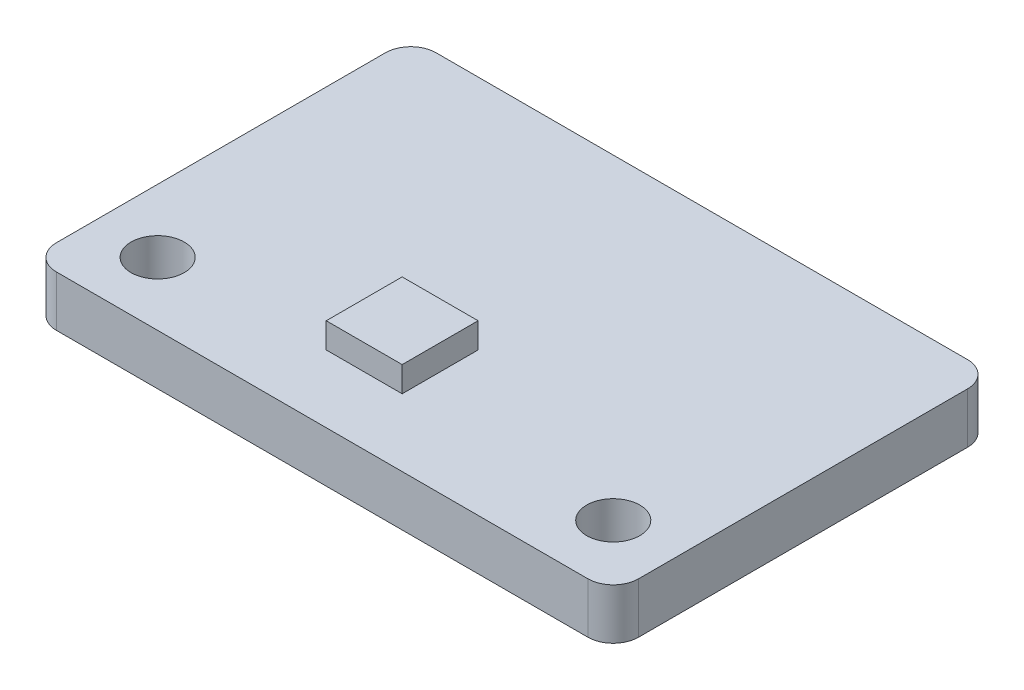
ISO-10303-21;
HEADER;
FILE_DESCRIPTION(('STEP AP214'),'2;1');
FILE_NAME('part.step','',(''),(''),'','','');
FILE_SCHEMA(('AUTOMOTIVE_DESIGN { 1 0 10303 214 1 1 1 1 }'));
ENDSEC;
DATA;
#1=APPLICATION_CONTEXT('core data for automotive mechanical design processes');
#2=APPLICATION_PROTOCOL_DEFINITION('international standard','automotive_design',2000,#1);
#3=PRODUCT_CONTEXT('',#1,'mechanical');
#4=PRODUCT('Part','Part','',(#3));
#5=PRODUCT_RELATED_PRODUCT_CATEGORY('part','',(#4));
#6=PRODUCT_DEFINITION_FORMATION('','',#4);
#7=PRODUCT_DEFINITION_CONTEXT('part definition',#1,'design');
#8=PRODUCT_DEFINITION('design','',#6,#7);
#9=PRODUCT_DEFINITION_SHAPE('','',#8);
#10=(LENGTH_UNIT() NAMED_UNIT(*) SI_UNIT(.MILLI.,.METRE.));
#11=(NAMED_UNIT(*) PLANE_ANGLE_UNIT() SI_UNIT($,.RADIAN.));
#12=(NAMED_UNIT(*) SI_UNIT($,.STERADIAN.) SOLID_ANGLE_UNIT());
#13=UNCERTAINTY_MEASURE_WITH_UNIT(LENGTH_MEASURE(1.E-05),#10,'distance_accuracy_value','');
#14=(GEOMETRIC_REPRESENTATION_CONTEXT(3) GLOBAL_UNCERTAINTY_ASSIGNED_CONTEXT((#13)) GLOBAL_UNIT_ASSIGNED_CONTEXT((#10,
#11,#12)) REPRESENTATION_CONTEXT('',''));
#15=CARTESIAN_POINT('',(0.,0.,0.));
#16=DIRECTION('',(0.,0.,1.));
#17=DIRECTION('',(1.,0.,0.));
#18=AXIS2_PLACEMENT_3D('',#15,#16,#17);
#19=CARTESIAN_POINT('',(1.,2.,-14.));
#20=DIRECTION('',(0.,-1.,0.));
#21=DIRECTION('',(0.,0.,-1.));
#22=AXIS2_PLACEMENT_3D('',#19,#20,#21);
#23=PLANE('',#22);
#24=CARTESIAN_POINT('',(20.5,2.,-2.5));
#25=DIRECTION('',(0.,1.,0.));
#26=DIRECTION('',(0.,0.,-1.));
#27=AXIS2_PLACEMENT_3D('',#24,#25,#26);
#28=CIRCLE('',#27,1.05);
#29=CARTESIAN_POINT('',(20.5,2.,-3.55));
#30=VERTEX_POINT('',#29);
#31=EDGE_CURVE('E149',#30,#30,#28,.T.);
#32=ORIENTED_EDGE('',*,*,#31,.F.);
#33=EDGE_LOOP('',(#32));
#34=FACE_BOUND('',#33,.T.);
#35=CARTESIAN_POINT('',(2.5,2.,-2.5));
#36=DIRECTION('',(0.,1.,0.));
#37=DIRECTION('',(0.,0.,1.));
#38=AXIS2_PLACEMENT_3D('',#35,#36,#37);
#39=CIRCLE('',#38,1.05);
#40=CARTESIAN_POINT('',(2.5,2.,-1.45));
#41=VERTEX_POINT('',#40);
#42=EDGE_CURVE('E158',#41,#41,#39,.T.);
#43=ORIENTED_EDGE('',*,*,#42,.F.);
#44=EDGE_LOOP('',(#43));
#45=FACE_BOUND('',#44,.T.);
#46=CARTESIAN_POINT('',(1.,2.,-14.));
#47=DIRECTION('',(0.,1.,0.));
#48=DIRECTION('',(0.,0.,-1.));
#49=AXIS2_PLACEMENT_3D('',#46,#47,#48);
#50=CIRCLE('',#49,1.);
#51=CARTESIAN_POINT('',(1.00000000000001,2.,-15.));
#52=VERTEX_POINT('',#51);
#53=CARTESIAN_POINT('',(0.,2.,-14.));
#54=VERTEX_POINT('',#53);
#55=EDGE_CURVE('E164',#52,#54,#50,.T.);
#56=ORIENTED_EDGE('',*,*,#55,.T.);
#57=DIRECTION('',(0.,0.,1.));
#58=VECTOR('',#57,1.);
#59=CARTESIAN_POINT('',(0.,2.,-1.00000000000001));
#60=LINE('',#59,#58);
#61=CARTESIAN_POINT('',(0.,2.,-1.00000000000001));
#62=VERTEX_POINT('',#61);
#63=EDGE_CURVE('E167',#54,#62,#60,.T.);
#64=ORIENTED_EDGE('',*,*,#63,.T.);
#65=CARTESIAN_POINT('',(1.,2.,-1.));
#66=DIRECTION('',(0.,1.,0.));
#67=DIRECTION('',(0.,0.,-1.));
#68=AXIS2_PLACEMENT_3D('',#65,#66,#67);
#69=CIRCLE('',#68,1.);
#70=CARTESIAN_POINT('',(1.00000000000001,2.,0.));
#71=VERTEX_POINT('',#70);
#72=EDGE_CURVE('E170',#62,#71,#69,.T.);
#73=ORIENTED_EDGE('',*,*,#72,.T.);
#74=DIRECTION('',(1.,0.,0.));
#75=VECTOR('',#74,1.);
#76=CARTESIAN_POINT('',(1.00000000000001,2.,0.));
#77=LINE('',#76,#75);
#78=CARTESIAN_POINT('',(22.,2.,0.));
#79=VERTEX_POINT('',#78);
#80=EDGE_CURVE('E172',#71,#79,#77,.T.);
#81=ORIENTED_EDGE('',*,*,#80,.T.);
#82=CARTESIAN_POINT('',(22.,2.,-1.));
#83=DIRECTION('',(0.,1.,0.));
#84=DIRECTION('',(0.,0.,1.));
#85=AXIS2_PLACEMENT_3D('',#82,#83,#84);
#86=CIRCLE('',#85,1.);
#87=CARTESIAN_POINT('',(23.,2.,-1.00000000000001));
#88=VERTEX_POINT('',#87);
#89=EDGE_CURVE('E174',#79,#88,#86,.T.);
#90=ORIENTED_EDGE('',*,*,#89,.T.);
#91=DIRECTION('',(0.,0.,-1.));
#92=VECTOR('',#91,1.);
#93=CARTESIAN_POINT('',(23.,2.,-1.00000000000001));
#94=LINE('',#93,#92);
#95=CARTESIAN_POINT('',(23.,2.,-14.));
#96=VERTEX_POINT('',#95);
#97=EDGE_CURVE('E176',#88,#96,#94,.T.);
#98=ORIENTED_EDGE('',*,*,#97,.T.);
#99=CARTESIAN_POINT('',(22.,2.,-14.));
#100=DIRECTION('',(0.,1.,0.));
#101=DIRECTION('',(0.,0.,-1.));
#102=AXIS2_PLACEMENT_3D('',#99,#100,#101);
#103=CIRCLE('',#102,1.);
#104=CARTESIAN_POINT('',(22.,2.,-15.));
#105=VERTEX_POINT('',#104);
#106=EDGE_CURVE('E178',#96,#105,#103,.T.);
#107=ORIENTED_EDGE('',*,*,#106,.T.);
#108=DIRECTION('',(-1.,0.,0.));
#109=VECTOR('',#108,1.);
#110=CARTESIAN_POINT('',(1.00000000000001,2.,-15.));
#111=LINE('',#110,#109);
#112=EDGE_CURVE('E180',#105,#52,#111,.T.);
#113=ORIENTED_EDGE('',*,*,#112,.T.);
#114=EDGE_LOOP('',(#56,#64,#73,#81,#90,#98,#107,#113));
#115=FACE_BOUND('',#114,.T.);
#116=DIRECTION('',(0.,0.,1.));
#117=VECTOR('',#116,1.);
#118=CARTESIAN_POINT('',(9.,2.,-5.66050835463749));
#119=LINE('',#118,#117);
#120=CARTESIAN_POINT('',(9.,2.,-5.66050835463749));
#121=VERTEX_POINT('',#120);
#122=CARTESIAN_POINT('',(9.,2.,-2.66050835463749));
#123=VERTEX_POINT('',#122);
#124=EDGE_CURVE('E145',#121,#123,#119,.T.);
#125=ORIENTED_EDGE('',*,*,#124,.F.);
#126=DIRECTION('',(-1.,0.,0.));
#127=VECTOR('',#126,1.);
#128=CARTESIAN_POINT('',(9.,2.,-5.66050835463749));
#129=LINE('',#128,#127);
#130=CARTESIAN_POINT('',(12.,2.,-5.66050835463749));
#131=VERTEX_POINT('',#130);
#132=EDGE_CURVE('E142',#131,#121,#129,.T.);
#133=ORIENTED_EDGE('',*,*,#132,.F.);
#134=DIRECTION('',(0.,0.,-1.));
#135=VECTOR('',#134,1.);
#136=CARTESIAN_POINT('',(12.,2.,-5.66050835463749));
#137=LINE('',#136,#135);
#138=CARTESIAN_POINT('',(12.,2.,-2.66050835463749));
#139=VERTEX_POINT('',#138);
#140=EDGE_CURVE('E56',#139,#131,#137,.T.);
#141=ORIENTED_EDGE('',*,*,#140,.F.);
#142=DIRECTION('',(1.,0.,0.));
#143=VECTOR('',#142,1.);
#144=CARTESIAN_POINT('',(9.,2.,-2.66050835463749));
#145=LINE('',#144,#143);
#146=EDGE_CURVE('E51',#123,#139,#145,.T.);
#147=ORIENTED_EDGE('',*,*,#146,.F.);
#148=EDGE_LOOP('',(#125,#133,#141,#147));
#149=FACE_BOUND('',#148,.T.);
#150=ADVANCED_FACE('F36',(#34,#45,#115,#149),#23,.F.);
#151=CARTESIAN_POINT('',(1.,0.,-14.));
#152=DIRECTION('',(0.,-1.,0.));
#153=DIRECTION('',(0.,0.,-1.));
#154=AXIS2_PLACEMENT_3D('',#151,#152,#153);
#155=PLANE('',#154);
#156=CARTESIAN_POINT('',(2.5,0.,-2.5));
#157=DIRECTION('',(0.,1.,0.));
#158=DIRECTION('',(0.,0.,1.));
#159=AXIS2_PLACEMENT_3D('',#156,#157,#158);
#160=CIRCLE('',#159,1.05);
#161=CARTESIAN_POINT('',(2.5,0.,-1.45));
#162=VERTEX_POINT('',#161);
#163=EDGE_CURVE('E156',#162,#162,#160,.T.);
#164=ORIENTED_EDGE('',*,*,#163,.T.);
#165=EDGE_LOOP('',(#164));
#166=FACE_BOUND('',#165,.T.);
#167=CARTESIAN_POINT('',(1.,0.,-14.));
#168=DIRECTION('',(0.,1.,0.));
#169=DIRECTION('',(0.,0.,-1.));
#170=AXIS2_PLACEMENT_3D('',#167,#168,#169);
#171=CIRCLE('',#170,1.);
#172=CARTESIAN_POINT('',(1.00000000000001,0.,-15.));
#173=VERTEX_POINT('',#172);
#174=CARTESIAN_POINT('',(0.,0.,-14.));
#175=VERTEX_POINT('',#174);
#176=EDGE_CURVE('E161',#173,#175,#171,.T.);
#177=ORIENTED_EDGE('',*,*,#176,.F.);
#178=DIRECTION('',(-1.,0.,0.));
#179=VECTOR('',#178,1.);
#180=CARTESIAN_POINT('',(1.00000000000001,0.,-15.));
#181=LINE('',#180,#179);
#182=CARTESIAN_POINT('',(22.,0.,-15.));
#183=VERTEX_POINT('',#182);
#184=EDGE_CURVE('E168',#183,#173,#181,.T.);
#185=ORIENTED_EDGE('',*,*,#184,.F.);
#186=CARTESIAN_POINT('',(22.,0.,-14.));
#187=DIRECTION('',(0.,1.,0.));
#188=DIRECTION('',(0.,0.,-1.));
#189=AXIS2_PLACEMENT_3D('',#186,#187,#188);
#190=CIRCLE('',#189,1.);
#191=CARTESIAN_POINT('',(23.,0.,-14.));
#192=VERTEX_POINT('',#191);
#193=EDGE_CURVE('E195',#192,#183,#190,.T.);
#194=ORIENTED_EDGE('',*,*,#193,.F.);
#195=DIRECTION('',(0.,0.,-1.));
#196=VECTOR('',#195,1.);
#197=CARTESIAN_POINT('',(23.,0.,-1.00000000000001));
#198=LINE('',#197,#196);
#199=CARTESIAN_POINT('',(23.,0.,-1.00000000000001));
#200=VERTEX_POINT('',#199);
#201=EDGE_CURVE('E193',#200,#192,#198,.T.);
#202=ORIENTED_EDGE('',*,*,#201,.F.);
#203=CARTESIAN_POINT('',(22.,0.,-1.));
#204=DIRECTION('',(0.,1.,0.));
#205=DIRECTION('',(0.,0.,1.));
#206=AXIS2_PLACEMENT_3D('',#203,#204,#205);
#207=CIRCLE('',#206,1.);
#208=CARTESIAN_POINT('',(22.,0.,0.));
#209=VERTEX_POINT('',#208);
#210=EDGE_CURVE('E191',#209,#200,#207,.T.);
#211=ORIENTED_EDGE('',*,*,#210,.F.);
#212=DIRECTION('',(1.,0.,0.));
#213=VECTOR('',#212,1.);
#214=CARTESIAN_POINT('',(1.00000000000001,0.,0.));
#215=LINE('',#214,#213);
#216=CARTESIAN_POINT('',(1.00000000000001,0.,0.));
#217=VERTEX_POINT('',#216);
#218=EDGE_CURVE('E189',#217,#209,#215,.T.);
#219=ORIENTED_EDGE('',*,*,#218,.F.);
#220=CARTESIAN_POINT('',(1.,0.,-1.));
#221=DIRECTION('',(0.,1.,0.));
#222=DIRECTION('',(0.,0.,-1.));
#223=AXIS2_PLACEMENT_3D('',#220,#221,#222);
#224=CIRCLE('',#223,1.);
#225=CARTESIAN_POINT('',(0.,0.,-1.00000000000001));
#226=VERTEX_POINT('',#225);
#227=EDGE_CURVE('E187',#226,#217,#224,.T.);
#228=ORIENTED_EDGE('',*,*,#227,.F.);
#229=DIRECTION('',(0.,0.,1.));
#230=VECTOR('',#229,1.);
#231=CARTESIAN_POINT('',(0.,0.,-1.00000000000001));
#232=LINE('',#231,#230);
#233=EDGE_CURVE('E185',#175,#226,#232,.T.);
#234=ORIENTED_EDGE('',*,*,#233,.F.);
#235=EDGE_LOOP('',(#177,#185,#194,#202,#211,#219,#228,#234));
#236=FACE_BOUND('',#235,.T.);
#237=CARTESIAN_POINT('',(20.5,0.,-2.5));
#238=DIRECTION('',(0.,1.,0.));
#239=DIRECTION('',(0.,0.,-1.));
#240=AXIS2_PLACEMENT_3D('',#237,#238,#239);
#241=CIRCLE('',#240,1.05);
#242=CARTESIAN_POINT('',(20.5,0.,-3.55));
#243=VERTEX_POINT('',#242);
#244=EDGE_CURVE('E146',#243,#243,#241,.T.);
#245=ORIENTED_EDGE('',*,*,#244,.T.);
#246=EDGE_LOOP('',(#245));
#247=FACE_BOUND('',#246,.T.);
#248=ADVANCED_FACE('F225',(#166,#236,#247),#155,.T.);
#249=CARTESIAN_POINT('',(1.,2.,-14.));
#250=DIRECTION('',(0.,-1.,0.));
#251=DIRECTION('',(0.,0.,-1.));
#252=AXIS2_PLACEMENT_3D('',#249,#250,#251);
#253=CYLINDRICAL_SURFACE('',#252,1.);
#254=ORIENTED_EDGE('',*,*,#176,.T.);
#255=DIRECTION('',(0.,-1.,0.));
#256=VECTOR('',#255,1.);
#257=CARTESIAN_POINT('',(0.,2.,-14.));
#258=LINE('',#257,#256);
#259=EDGE_CURVE('E11',#54,#175,#258,.T.);
#260=ORIENTED_EDGE('',*,*,#259,.F.);
#261=ORIENTED_EDGE('',*,*,#55,.F.);
#262=DIRECTION('',(0.,-1.,0.));
#263=VECTOR('',#262,1.);
#264=CARTESIAN_POINT('',(1.00000000000001,2.,-15.));
#265=LINE('',#264,#263);
#266=EDGE_CURVE('E182',#52,#173,#265,.T.);
#267=ORIENTED_EDGE('',*,*,#266,.T.);
#268=EDGE_LOOP('',(#254,#260,#261,#267));
#269=FACE_BOUND('',#268,.T.);
#270=ADVANCED_FACE('F38',(#269),#253,.T.);
#271=CARTESIAN_POINT('',(0.,2.,-1.00000000000001));
#272=DIRECTION('',(1.,0.,0.));
#273=DIRECTION('',(0.,0.,-1.));
#274=AXIS2_PLACEMENT_3D('',#271,#272,#273);
#275=PLANE('',#274);
#276=ORIENTED_EDGE('',*,*,#233,.T.);
#277=DIRECTION('',(0.,-1.,0.));
#278=VECTOR('',#277,1.);
#279=CARTESIAN_POINT('',(0.,2.,-1.00000000000001));
#280=LINE('',#279,#278);
#281=EDGE_CURVE('E44',#62,#226,#280,.T.);
#282=ORIENTED_EDGE('',*,*,#281,.F.);
#283=ORIENTED_EDGE('',*,*,#63,.F.);
#284=ORIENTED_EDGE('',*,*,#259,.T.);
#285=EDGE_LOOP('',(#276,#282,#283,#284));
#286=FACE_BOUND('',#285,.T.);
#287=ADVANCED_FACE('F242',(#286),#275,.F.);
#288=CARTESIAN_POINT('',(1.,2.,-1.));
#289=DIRECTION('',(0.,-1.,0.));
#290=DIRECTION('',(0.,0.,-1.));
#291=AXIS2_PLACEMENT_3D('',#288,#289,#290);
#292=CYLINDRICAL_SURFACE('',#291,1.);
#293=ORIENTED_EDGE('',*,*,#227,.T.);
#294=DIRECTION('',(0.,-1.,0.));
#295=VECTOR('',#294,1.);
#296=CARTESIAN_POINT('',(1.00000000000001,2.,0.));
#297=LINE('',#296,#295);
#298=EDGE_CURVE('E212',#71,#217,#297,.T.);
#299=ORIENTED_EDGE('',*,*,#298,.F.);
#300=ORIENTED_EDGE('',*,*,#72,.F.);
#301=ORIENTED_EDGE('',*,*,#281,.T.);
#302=EDGE_LOOP('',(#293,#299,#300,#301));
#303=FACE_BOUND('',#302,.T.);
#304=ADVANCED_FACE('F219',(#303),#292,.T.);
#305=CARTESIAN_POINT('',(1.00000000000001,2.,0.));
#306=DIRECTION('',(0.,0.,-1.));
#307=DIRECTION('',(-1.,0.,0.));
#308=AXIS2_PLACEMENT_3D('',#305,#306,#307);
#309=PLANE('',#308);
#310=ORIENTED_EDGE('',*,*,#218,.T.);
#311=DIRECTION('',(0.,-1.,0.));
#312=VECTOR('',#311,1.);
#313=CARTESIAN_POINT('',(22.,2.,0.));
#314=LINE('',#313,#312);
#315=EDGE_CURVE('E209',#79,#209,#314,.T.);
#316=ORIENTED_EDGE('',*,*,#315,.F.);
#317=ORIENTED_EDGE('',*,*,#80,.F.);
#318=ORIENTED_EDGE('',*,*,#298,.T.);
#319=EDGE_LOOP('',(#310,#316,#317,#318));
#320=FACE_BOUND('',#319,.T.);
#321=ADVANCED_FACE('F231',(#320),#309,.F.);
#322=CARTESIAN_POINT('',(22.,2.,-1.));
#323=DIRECTION('',(0.,-1.,0.));
#324=DIRECTION('',(0.,0.,-1.));
#325=AXIS2_PLACEMENT_3D('',#322,#323,#324);
#326=CYLINDRICAL_SURFACE('',#325,1.);
#327=ORIENTED_EDGE('',*,*,#210,.T.);
#328=DIRECTION('',(0.,-1.,0.));
#329=VECTOR('',#328,1.);
#330=CARTESIAN_POINT('',(23.,2.,-1.00000000000001));
#331=LINE('',#330,#329);
#332=EDGE_CURVE('E206',#88,#200,#331,.T.);
#333=ORIENTED_EDGE('',*,*,#332,.F.);
#334=ORIENTED_EDGE('',*,*,#89,.F.);
#335=ORIENTED_EDGE('',*,*,#315,.T.);
#336=EDGE_LOOP('',(#327,#333,#334,#335));
#337=FACE_BOUND('',#336,.T.);
#338=ADVANCED_FACE('F235',(#337),#326,.T.);
#339=CARTESIAN_POINT('',(23.,2.,-1.00000000000001));
#340=DIRECTION('',(-1.,0.,0.));
#341=DIRECTION('',(0.,0.,1.));
#342=AXIS2_PLACEMENT_3D('',#339,#340,#341);
#343=PLANE('',#342);
#344=ORIENTED_EDGE('',*,*,#201,.T.);
#345=DIRECTION('',(0.,-1.,0.));
#346=VECTOR('',#345,1.);
#347=CARTESIAN_POINT('',(23.,2.,-14.));
#348=LINE('',#347,#346);
#349=EDGE_CURVE('E203',#96,#192,#348,.T.);
#350=ORIENTED_EDGE('',*,*,#349,.F.);
#351=ORIENTED_EDGE('',*,*,#97,.F.);
#352=ORIENTED_EDGE('',*,*,#332,.T.);
#353=EDGE_LOOP('',(#344,#350,#351,#352));
#354=FACE_BOUND('',#353,.T.);
#355=ADVANCED_FACE('F255',(#354),#343,.F.);
#356=CARTESIAN_POINT('',(22.,2.,-14.));
#357=DIRECTION('',(0.,-1.,0.));
#358=DIRECTION('',(0.,0.,-1.));
#359=AXIS2_PLACEMENT_3D('',#356,#357,#358);
#360=CYLINDRICAL_SURFACE('',#359,1.);
#361=ORIENTED_EDGE('',*,*,#193,.T.);
#362=DIRECTION('',(0.,-1.,0.));
#363=VECTOR('',#362,1.);
#364=CARTESIAN_POINT('',(22.,2.,-15.));
#365=LINE('',#364,#363);
#366=EDGE_CURVE('E200',#105,#183,#365,.T.);
#367=ORIENTED_EDGE('',*,*,#366,.F.);
#368=ORIENTED_EDGE('',*,*,#106,.F.);
#369=ORIENTED_EDGE('',*,*,#349,.T.);
#370=EDGE_LOOP('',(#361,#367,#368,#369));
#371=FACE_BOUND('',#370,.T.);
#372=ADVANCED_FACE('F253',(#371),#360,.T.);
#373=CARTESIAN_POINT('',(1.00000000000001,2.,-15.));
#374=DIRECTION('',(0.,0.,1.));
#375=DIRECTION('',(1.,0.,0.));
#376=AXIS2_PLACEMENT_3D('',#373,#374,#375);
#377=PLANE('',#376);
#378=ORIENTED_EDGE('',*,*,#184,.T.);
#379=ORIENTED_EDGE('',*,*,#266,.F.);
#380=ORIENTED_EDGE('',*,*,#112,.F.);
#381=ORIENTED_EDGE('',*,*,#366,.T.);
#382=EDGE_LOOP('',(#378,#379,#380,#381));
#383=FACE_BOUND('',#382,.T.);
#384=ADVANCED_FACE('F248',(#383),#377,.F.);
#385=CARTESIAN_POINT('',(2.5,2.,-2.5));
#386=DIRECTION('',(0.,-1.,0.));
#387=DIRECTION('',(0.,0.,-1.));
#388=AXIS2_PLACEMENT_3D('',#385,#386,#387);
#389=CYLINDRICAL_SURFACE('',#388,1.05);
#390=ORIENTED_EDGE('',*,*,#42,.T.);
#391=EDGE_LOOP('',(#390));
#392=FACE_BOUND('',#391,.T.);
#393=ORIENTED_EDGE('',*,*,#163,.F.);
#394=EDGE_LOOP('',(#393));
#395=FACE_BOUND('',#394,.T.);
#396=ADVANCED_FACE('F275',(#392,#395),#389,.F.);
#397=CARTESIAN_POINT('',(20.5,2.,-2.5));
#398=DIRECTION('',(0.,-1.,0.));
#399=DIRECTION('',(0.,0.,-1.));
#400=AXIS2_PLACEMENT_3D('',#397,#398,#399);
#401=CYLINDRICAL_SURFACE('',#400,1.05);
#402=ORIENTED_EDGE('',*,*,#31,.T.);
#403=EDGE_LOOP('',(#402));
#404=FACE_BOUND('',#403,.T.);
#405=ORIENTED_EDGE('',*,*,#244,.F.);
#406=EDGE_LOOP('',(#405));
#407=FACE_BOUND('',#406,.T.);
#408=ADVANCED_FACE('F282',(#404,#407),#401,.F.);
#409=CARTESIAN_POINT('',(9.,3.,-5.66050835463749));
#410=DIRECTION('',(1.,0.,0.));
#411=DIRECTION('',(0.,0.,-1.));
#412=AXIS2_PLACEMENT_3D('',#409,#410,#411);
#413=PLANE('',#412);
#414=ORIENTED_EDGE('',*,*,#124,.T.);
#415=DIRECTION('',(0.,-1.,0.));
#416=VECTOR('',#415,1.);
#417=CARTESIAN_POINT('',(9.,3.,-2.66050835463749));
#418=LINE('',#417,#416);
#419=CARTESIAN_POINT('',(9.,3.,-2.66050835463749));
#420=VERTEX_POINT('',#419);
#421=EDGE_CURVE('E126',#420,#123,#418,.T.);
#422=ORIENTED_EDGE('',*,*,#421,.F.);
#423=DIRECTION('',(0.,0.,1.));
#424=VECTOR('',#423,1.);
#425=CARTESIAN_POINT('',(9.,3.,-5.66050835463749));
#426=LINE('',#425,#424);
#427=CARTESIAN_POINT('',(9.,3.,-5.66050835463749));
#428=VERTEX_POINT('',#427);
#429=EDGE_CURVE('E133',#428,#420,#426,.T.);
#430=ORIENTED_EDGE('',*,*,#429,.F.);
#431=DIRECTION('',(0.,-1.,0.));
#432=VECTOR('',#431,1.);
#433=CARTESIAN_POINT('',(9.,3.,-5.66050835463749));
#434=LINE('',#433,#432);
#435=EDGE_CURVE('E408',#428,#121,#434,.T.);
#436=ORIENTED_EDGE('',*,*,#435,.T.);
#437=EDGE_LOOP('',(#414,#422,#430,#436));
#438=FACE_BOUND('',#437,.T.);
#439=ADVANCED_FACE('F144',(#438),#413,.F.);
#440=CARTESIAN_POINT('',(9.,3.,-2.66050835463749));
#441=DIRECTION('',(0.,0.,-1.));
#442=DIRECTION('',(-1.,0.,0.));
#443=AXIS2_PLACEMENT_3D('',#440,#441,#442);
#444=PLANE('',#443);
#445=ORIENTED_EDGE('',*,*,#146,.T.);
#446=DIRECTION('',(0.,-1.,0.));
#447=VECTOR('',#446,1.);
#448=CARTESIAN_POINT('',(12.,3.,-2.66050835463749));
#449=LINE('',#448,#447);
#450=CARTESIAN_POINT('',(12.,3.,-2.66050835463749));
#451=VERTEX_POINT('',#450);
#452=EDGE_CURVE('E129',#451,#139,#449,.T.);
#453=ORIENTED_EDGE('',*,*,#452,.F.);
#454=DIRECTION('',(1.,0.,0.));
#455=VECTOR('',#454,1.);
#456=CARTESIAN_POINT('',(9.,3.,-2.66050835463749));
#457=LINE('',#456,#455);
#458=EDGE_CURVE('E122',#420,#451,#457,.T.);
#459=ORIENTED_EDGE('',*,*,#458,.F.);
#460=ORIENTED_EDGE('',*,*,#421,.T.);
#461=EDGE_LOOP('',(#445,#453,#459,#460));
#462=FACE_BOUND('',#461,.T.);
#463=ADVANCED_FACE('F124',(#462),#444,.F.);
#464=CARTESIAN_POINT('',(12.,3.,-5.66050835463749));
#465=DIRECTION('',(-1.,0.,0.));
#466=DIRECTION('',(0.,0.,1.));
#467=AXIS2_PLACEMENT_3D('',#464,#465,#466);
#468=PLANE('',#467);
#469=ORIENTED_EDGE('',*,*,#140,.T.);
#470=DIRECTION('',(0.,-1.,0.));
#471=VECTOR('',#470,1.);
#472=CARTESIAN_POINT('',(12.,3.,-5.66050835463749));
#473=LINE('',#472,#471);
#474=CARTESIAN_POINT('',(12.,3.,-5.66050835463749));
#475=VERTEX_POINT('',#474);
#476=EDGE_CURVE('E151',#475,#131,#473,.T.);
#477=ORIENTED_EDGE('',*,*,#476,.F.);
#478=DIRECTION('',(0.,0.,-1.));
#479=VECTOR('',#478,1.);
#480=CARTESIAN_POINT('',(12.,3.,-5.66050835463749));
#481=LINE('',#480,#479);
#482=EDGE_CURVE('E132',#451,#475,#481,.T.);
#483=ORIENTED_EDGE('',*,*,#482,.F.);
#484=ORIENTED_EDGE('',*,*,#452,.T.);
#485=EDGE_LOOP('',(#469,#477,#483,#484));
#486=FACE_BOUND('',#485,.T.);
#487=ADVANCED_FACE('F299',(#486),#468,.F.);
#488=CARTESIAN_POINT('',(9.,3.,-5.66050835463749));
#489=DIRECTION('',(0.,0.,1.));
#490=DIRECTION('',(1.,0.,0.));
#491=AXIS2_PLACEMENT_3D('',#488,#489,#490);
#492=PLANE('',#491);
#493=ORIENTED_EDGE('',*,*,#132,.T.);
#494=ORIENTED_EDGE('',*,*,#435,.F.);
#495=DIRECTION('',(-1.,0.,0.));
#496=VECTOR('',#495,1.);
#497=CARTESIAN_POINT('',(9.,3.,-5.66050835463749));
#498=LINE('',#497,#496);
#499=EDGE_CURVE('E138',#475,#428,#498,.T.);
#500=ORIENTED_EDGE('',*,*,#499,.F.);
#501=ORIENTED_EDGE('',*,*,#476,.T.);
#502=EDGE_LOOP('',(#493,#494,#500,#501));
#503=FACE_BOUND('',#502,.T.);
#504=ADVANCED_FACE('F302',(#503),#492,.F.);
#505=CARTESIAN_POINT('',(0.,3.,0.));
#506=DIRECTION('',(0.,1.,0.));
#507=DIRECTION('',(0.,0.,1.));
#508=AXIS2_PLACEMENT_3D('',#505,#506,#507);
#509=PLANE('',#508);
#510=ORIENTED_EDGE('',*,*,#429,.T.);
#511=ORIENTED_EDGE('',*,*,#458,.T.);
#512=ORIENTED_EDGE('',*,*,#482,.T.);
#513=ORIENTED_EDGE('',*,*,#499,.T.);
#514=EDGE_LOOP('',(#510,#511,#512,#513));
#515=FACE_BOUND('',#514,.T.);
#516=ADVANCED_FACE('F136',(#515),#509,.T.);
#517=CLOSED_SHELL('',(#150,#248,#270,#287,#304,#321,#338,#355,#372,#384,#396,#408,#439,#463,
#487,#504,#516));
#518=MANIFOLD_SOLID_BREP('B2',#517);
#519=ADVANCED_BREP_SHAPE_REPRESENTATION('',(#18,#518),#14);
#520=SHAPE_DEFINITION_REPRESENTATION(#9,#519);
ENDSEC;
END-ISO-10303-21;
